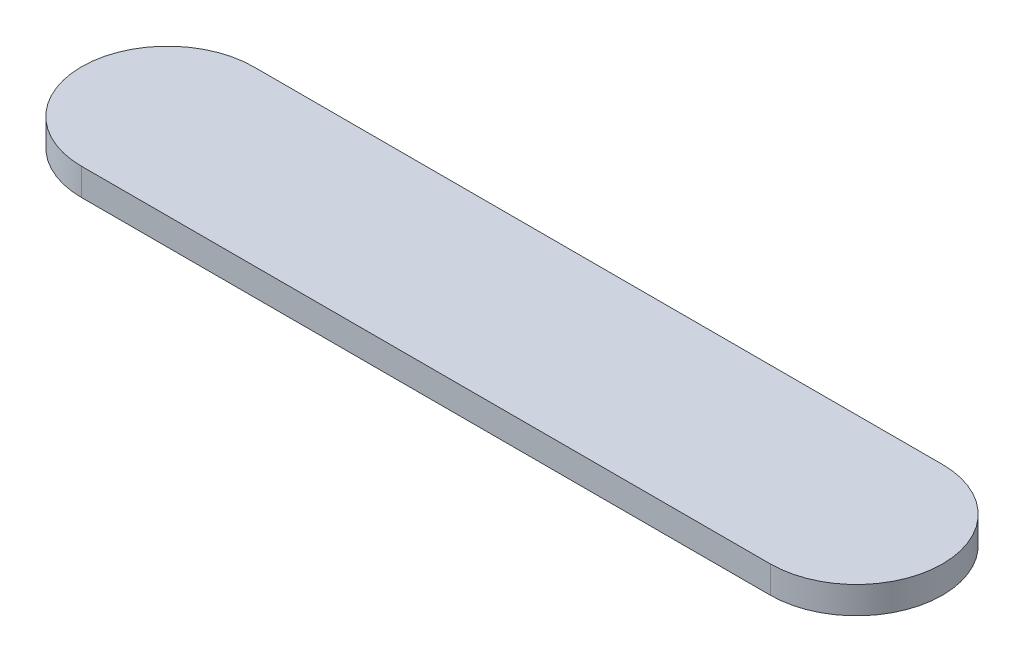
ISO-10303-21;
HEADER;
FILE_DESCRIPTION(('STEP AP214'),'2;1');
FILE_NAME('part.step','',(''),(''),'','','');
FILE_SCHEMA(('AUTOMOTIVE_DESIGN { 1 0 10303 214 1 1 1 1 }'));
ENDSEC;
DATA;
#1=APPLICATION_CONTEXT('core data for automotive mechanical design processes');
#2=APPLICATION_PROTOCOL_DEFINITION('international standard','automotive_design',2000,#1);
#3=PRODUCT_CONTEXT('',#1,'mechanical');
#4=PRODUCT('Part','Part','',(#3));
#5=PRODUCT_RELATED_PRODUCT_CATEGORY('part','',(#4));
#6=PRODUCT_DEFINITION_FORMATION('','',#4);
#7=PRODUCT_DEFINITION_CONTEXT('part definition',#1,'design');
#8=PRODUCT_DEFINITION('design','',#6,#7);
#9=PRODUCT_DEFINITION_SHAPE('','',#8);
#10=(LENGTH_UNIT() NAMED_UNIT(*) SI_UNIT(.MILLI.,.METRE.));
#11=(NAMED_UNIT(*) PLANE_ANGLE_UNIT() SI_UNIT($,.RADIAN.));
#12=(NAMED_UNIT(*) SI_UNIT($,.STERADIAN.) SOLID_ANGLE_UNIT());
#13=UNCERTAINTY_MEASURE_WITH_UNIT(LENGTH_MEASURE(1.E-05),#10,'distance_accuracy_value','');
#14=(GEOMETRIC_REPRESENTATION_CONTEXT(3) GLOBAL_UNCERTAINTY_ASSIGNED_CONTEXT((#13)) GLOBAL_UNIT_ASSIGNED_CONTEXT((#10,
#11,#12)) REPRESENTATION_CONTEXT('',''));
#15=CARTESIAN_POINT('',(0.,0.,0.));
#16=DIRECTION('',(0.,0.,1.));
#17=DIRECTION('',(1.,0.,0.));
#18=AXIS2_PLACEMENT_3D('',#15,#16,#17);
#19=CARTESIAN_POINT('',(50.8,4.,0.));
#20=DIRECTION('',(0.,-1.,0.));
#21=DIRECTION('',(0.,0.,-1.));
#22=AXIS2_PLACEMENT_3D('',#19,#20,#21);
#23=CYLINDRICAL_SURFACE('',#22,12.7);
#24=CARTESIAN_POINT('',(50.8,0.,0.));
#25=DIRECTION('',(0.,1.,0.));
#26=DIRECTION('',(0.,0.,1.));
#27=AXIS2_PLACEMENT_3D('',#24,#25,#26);
#28=CIRCLE('',#27,12.7);
#29=CARTESIAN_POINT('',(50.8,0.,12.7));
#30=VERTEX_POINT('',#29);
#31=CARTESIAN_POINT('',(50.8,0.,-12.7));
#32=VERTEX_POINT('',#31);
#33=EDGE_CURVE('E107',#30,#32,#28,.T.);
#34=ORIENTED_EDGE('',*,*,#33,.T.);
#35=DIRECTION('',(0.,-1.,0.));
#36=VECTOR('',#35,1.);
#37=CARTESIAN_POINT('',(50.8,4.,-12.7));
#38=LINE('',#37,#36);
#39=CARTESIAN_POINT('',(50.8,4.,-12.7));
#40=VERTEX_POINT('',#39);
#41=EDGE_CURVE('E11',#40,#32,#38,.T.);
#42=ORIENTED_EDGE('',*,*,#41,.F.);
#43=CARTESIAN_POINT('',(50.8,4.,0.));
#44=DIRECTION('',(0.,1.,0.));
#45=DIRECTION('',(0.,0.,1.));
#46=AXIS2_PLACEMENT_3D('',#43,#44,#45);
#47=CIRCLE('',#46,12.7);
#48=CARTESIAN_POINT('',(50.8,4.,12.7));
#49=VERTEX_POINT('',#48);
#50=EDGE_CURVE('E91',#49,#40,#47,.T.);
#51=ORIENTED_EDGE('',*,*,#50,.F.);
#52=DIRECTION('',(0.,-1.,0.));
#53=VECTOR('',#52,1.);
#54=CARTESIAN_POINT('',(50.8,4.,12.7));
#55=LINE('',#54,#53);
#56=EDGE_CURVE('E103',#49,#30,#55,.T.);
#57=ORIENTED_EDGE('',*,*,#56,.T.);
#58=EDGE_LOOP('',(#34,#42,#51,#57));
#59=FACE_BOUND('',#58,.T.);
#60=ADVANCED_FACE('F39',(#59),#23,.T.);
#61=CARTESIAN_POINT('',(-50.8,4.,-12.7));
#62=DIRECTION('',(0.,0.,1.));
#63=DIRECTION('',(1.,0.,0.));
#64=AXIS2_PLACEMENT_3D('',#61,#62,#63);
#65=PLANE('',#64);
#66=DIRECTION('',(-1.,0.,0.));
#67=VECTOR('',#66,1.);
#68=CARTESIAN_POINT('',(-50.8,0.,-12.7));
#69=LINE('',#68,#67);
#70=CARTESIAN_POINT('',(-50.8,0.,-12.7));
#71=VERTEX_POINT('',#70);
#72=EDGE_CURVE('E96',#32,#71,#69,.T.);
#73=ORIENTED_EDGE('',*,*,#72,.T.);
#74=DIRECTION('',(0.,-1.,0.));
#75=VECTOR('',#74,1.);
#76=CARTESIAN_POINT('',(-50.8,4.,-12.7));
#77=LINE('',#76,#75);
#78=CARTESIAN_POINT('',(-50.8,4.,-12.7));
#79=VERTEX_POINT('',#78);
#80=EDGE_CURVE('E48',#79,#71,#77,.T.);
#81=ORIENTED_EDGE('',*,*,#80,.F.);
#82=DIRECTION('',(-1.,0.,0.));
#83=VECTOR('',#82,1.);
#84=CARTESIAN_POINT('',(-50.8,4.,-12.7));
#85=LINE('',#84,#83);
#86=EDGE_CURVE('E86',#40,#79,#85,.T.);
#87=ORIENTED_EDGE('',*,*,#86,.F.);
#88=ORIENTED_EDGE('',*,*,#41,.T.);
#89=EDGE_LOOP('',(#73,#81,#87,#88));
#90=FACE_BOUND('',#89,.T.);
#91=ADVANCED_FACE('F95',(#90),#65,.F.);
#92=CARTESIAN_POINT('',(-50.8,4.,0.));
#93=DIRECTION('',(0.,-1.,0.));
#94=DIRECTION('',(0.,0.,-1.));
#95=AXIS2_PLACEMENT_3D('',#92,#93,#94);
#96=CYLINDRICAL_SURFACE('',#95,12.7);
#97=CARTESIAN_POINT('',(-50.8,0.,0.));
#98=DIRECTION('',(0.,1.,0.));
#99=DIRECTION('',(0.,0.,1.));
#100=AXIS2_PLACEMENT_3D('',#97,#98,#99);
#101=CIRCLE('',#100,12.7);
#102=CARTESIAN_POINT('',(-50.8,0.,12.7));
#103=VERTEX_POINT('',#102);
#104=EDGE_CURVE('E73',#71,#103,#101,.T.);
#105=ORIENTED_EDGE('',*,*,#104,.T.);
#106=DIRECTION('',(0.,-1.,0.));
#107=VECTOR('',#106,1.);
#108=CARTESIAN_POINT('',(-50.8,4.,12.7));
#109=LINE('',#108,#107);
#110=CARTESIAN_POINT('',(-50.8,4.,12.7));
#111=VERTEX_POINT('',#110);
#112=EDGE_CURVE('E98',#111,#103,#109,.T.);
#113=ORIENTED_EDGE('',*,*,#112,.F.);
#114=CARTESIAN_POINT('',(-50.8,4.,0.));
#115=DIRECTION('',(0.,1.,0.));
#116=DIRECTION('',(0.,0.,1.));
#117=AXIS2_PLACEMENT_3D('',#114,#115,#116);
#118=CIRCLE('',#117,12.7);
#119=EDGE_CURVE('E89',#79,#111,#118,.T.);
#120=ORIENTED_EDGE('',*,*,#119,.F.);
#121=ORIENTED_EDGE('',*,*,#80,.T.);
#122=EDGE_LOOP('',(#105,#113,#120,#121));
#123=FACE_BOUND('',#122,.T.);
#124=ADVANCED_FACE('F99',(#123),#96,.T.);
#125=CARTESIAN_POINT('',(-50.8,4.,12.7));
#126=DIRECTION('',(0.,0.,-1.));
#127=DIRECTION('',(-1.,0.,0.));
#128=AXIS2_PLACEMENT_3D('',#125,#126,#127);
#129=PLANE('',#128);
#130=DIRECTION('',(1.,0.,0.));
#131=VECTOR('',#130,1.);
#132=CARTESIAN_POINT('',(-50.8,0.,12.7));
#133=LINE('',#132,#131);
#134=EDGE_CURVE('E79',#103,#30,#133,.T.);
#135=ORIENTED_EDGE('',*,*,#134,.T.);
#136=ORIENTED_EDGE('',*,*,#56,.F.);
#137=DIRECTION('',(1.,0.,0.));
#138=VECTOR('',#137,1.);
#139=CARTESIAN_POINT('',(-50.8,4.,12.7));
#140=LINE('',#139,#138);
#141=EDGE_CURVE('E56',#111,#49,#140,.T.);
#142=ORIENTED_EDGE('',*,*,#141,.F.);
#143=ORIENTED_EDGE('',*,*,#112,.T.);
#144=EDGE_LOOP('',(#135,#136,#142,#143));
#145=FACE_BOUND('',#144,.T.);
#146=ADVANCED_FACE('F120',(#145),#129,.F.);
#147=CARTESIAN_POINT('',(50.8,4.,0.));
#148=DIRECTION('',(0.,1.,0.));
#149=DIRECTION('',(0.,0.,1.));
#150=AXIS2_PLACEMENT_3D('',#147,#148,#149);
#151=PLANE('',#150);
#152=ORIENTED_EDGE('',*,*,#50,.T.);
#153=ORIENTED_EDGE('',*,*,#86,.T.);
#154=ORIENTED_EDGE('',*,*,#119,.T.);
#155=ORIENTED_EDGE('',*,*,#141,.T.);
#156=EDGE_LOOP('',(#152,#153,#154,#155));
#157=FACE_BOUND('',#156,.T.);
#158=ADVANCED_FACE('F87',(#157),#151,.T.);
#159=CARTESIAN_POINT('',(50.8,0.,0.));
#160=DIRECTION('',(0.,1.,0.));
#161=DIRECTION('',(0.,0.,1.));
#162=AXIS2_PLACEMENT_3D('',#159,#160,#161);
#163=PLANE('',#162);
#164=ORIENTED_EDGE('',*,*,#33,.F.);
#165=ORIENTED_EDGE('',*,*,#134,.F.);
#166=ORIENTED_EDGE('',*,*,#104,.F.);
#167=ORIENTED_EDGE('',*,*,#72,.F.);
#168=EDGE_LOOP('',(#164,#165,#166,#167));
#169=FACE_BOUND('',#168,.T.);
#170=ADVANCED_FACE('F123',(#169),#163,.F.);
#171=CLOSED_SHELL('',(#60,#91,#124,#146,#158,#170));
#172=MANIFOLD_SOLID_BREP('B2',#171);
#173=ADVANCED_BREP_SHAPE_REPRESENTATION('',(#18,#172),#14);
#174=SHAPE_DEFINITION_REPRESENTATION(#9,#173);
ENDSEC;
END-ISO-10303-21;
